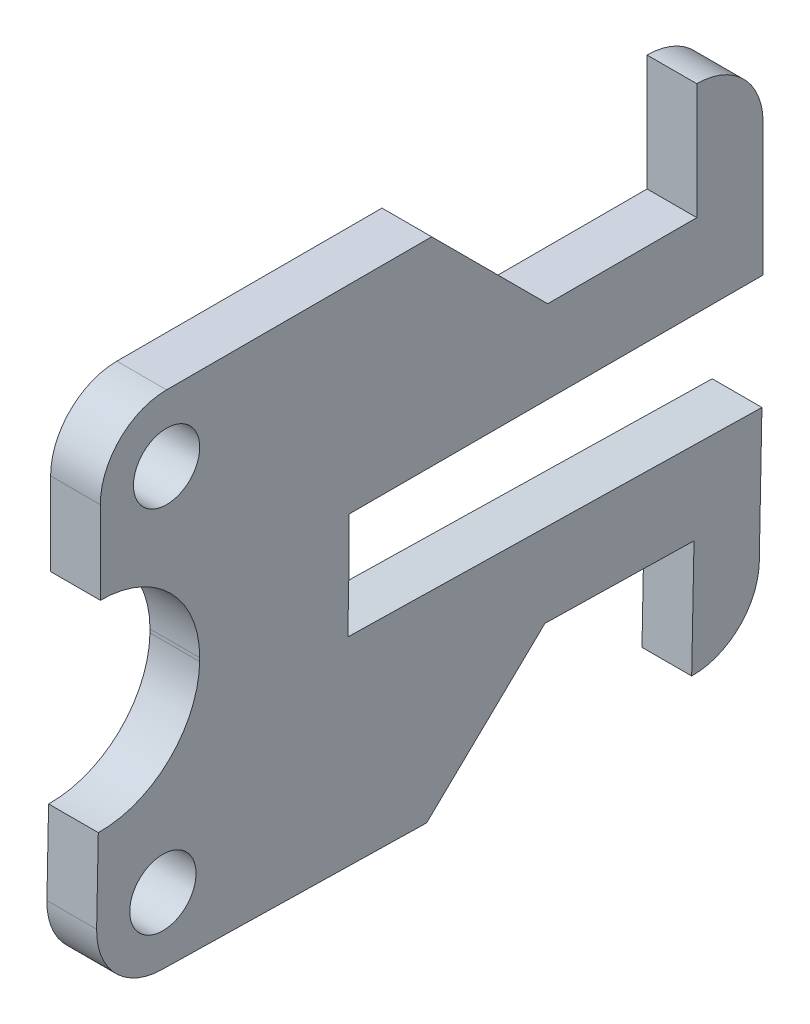
ISO-10303-21;
HEADER;
FILE_DESCRIPTION(('STEP AP214'),'2;1');
FILE_NAME('part.step','',(''),(''),'','','');
FILE_SCHEMA(('AUTOMOTIVE_DESIGN { 1 0 10303 214 1 1 1 1 }'));
ENDSEC;
DATA;
#1=APPLICATION_CONTEXT('core data for automotive mechanical design processes');
#2=APPLICATION_PROTOCOL_DEFINITION('international standard','automotive_design',2000,#1);
#3=PRODUCT_CONTEXT('',#1,'mechanical');
#4=PRODUCT('Part','Part','',(#3));
#5=PRODUCT_RELATED_PRODUCT_CATEGORY('part','',(#4));
#6=PRODUCT_DEFINITION_FORMATION('','',#4);
#7=PRODUCT_DEFINITION_CONTEXT('part definition',#1,'design');
#8=PRODUCT_DEFINITION('design','',#6,#7);
#9=PRODUCT_DEFINITION_SHAPE('','',#8);
#10=(LENGTH_UNIT() NAMED_UNIT(*) SI_UNIT(.MILLI.,.METRE.));
#11=(NAMED_UNIT(*) PLANE_ANGLE_UNIT() SI_UNIT($,.RADIAN.));
#12=(NAMED_UNIT(*) SI_UNIT($,.STERADIAN.) SOLID_ANGLE_UNIT());
#13=UNCERTAINTY_MEASURE_WITH_UNIT(LENGTH_MEASURE(1.E-05),#10,'distance_accuracy_value','');
#14=(GEOMETRIC_REPRESENTATION_CONTEXT(3) GLOBAL_UNCERTAINTY_ASSIGNED_CONTEXT((#13)) GLOBAL_UNIT_ASSIGNED_CONTEXT((#10,
#11,#12)) REPRESENTATION_CONTEXT('',''));
#15=CARTESIAN_POINT('',(0.,0.,0.));
#16=DIRECTION('',(0.,0.,1.));
#17=DIRECTION('',(1.,0.,0.));
#18=AXIS2_PLACEMENT_3D('',#15,#16,#17);
#19=CARTESIAN_POINT('',(1.5,-11.8042309209508,-20.7707604517279));
#20=DIRECTION('',(1.,0.,0.));
#21=DIRECTION('',(0.,0.,-1.));
#22=AXIS2_PLACEMENT_3D('',#19,#20,#21);
#23=PLANE('',#22);
#24=CARTESIAN_POINT('',(1.5,11.,11.));
#25=DIRECTION('',(1.,0.,0.));
#26=DIRECTION('',(0.,0.,-1.));
#27=AXIS2_PLACEMENT_3D('',#24,#25,#26);
#28=CIRCLE('',#27,2.);
#29=CARTESIAN_POINT('',(1.5,11.,9.));
#30=VERTEX_POINT('',#29);
#31=EDGE_CURVE('E236',#30,#30,#28,.T.);
#32=ORIENTED_EDGE('',*,*,#31,.F.);
#33=EDGE_LOOP('',(#32));
#34=FACE_BOUND('',#33,.T.);
#35=DIRECTION('',(0.,0.999949477443459,-0.010051992864757));
#36=VECTOR('',#35,1.);
#37=CARTESIAN_POINT('',(1.5,0.,0.));
#38=LINE('',#37,#36);
#39=CARTESIAN_POINT('',(1.5,-0.384291486762399,0.00386309045612848));
#40=VERTEX_POINT('',#39);
#41=CARTESIAN_POINT('',(1.5,0.,0.));
#42=VERTEX_POINT('',#41);
#43=EDGE_CURVE('E276',#40,#42,#38,.T.);
#44=ORIENTED_EDGE('',*,*,#43,.T.);
#45=DIRECTION('',(0.,1.,0.));
#46=VECTOR('',#45,1.);
#47=CARTESIAN_POINT('',(1.5,0.,0.));
#48=LINE('',#47,#46);
#49=CARTESIAN_POINT('',(1.5,3.,0.));
#50=VERTEX_POINT('',#49);
#51=EDGE_CURVE('E150',#42,#50,#48,.T.);
#52=ORIENTED_EDGE('',*,*,#51,.T.);
#53=DIRECTION('',(0.,0.,-1.));
#54=VECTOR('',#53,1.);
#55=CARTESIAN_POINT('',(1.5,3.,0.));
#56=LINE('',#55,#54);
#57=CARTESIAN_POINT('',(1.5,3.,-25.));
#58=VERTEX_POINT('',#57);
#59=EDGE_CURVE('E345',#50,#58,#56,.T.);
#60=ORIENTED_EDGE('',*,*,#59,.T.);
#61=DIRECTION('',(0.,1.,0.));
#62=VECTOR('',#61,1.);
#63=CARTESIAN_POINT('',(1.5,3.,-25.));
#64=LINE('',#63,#62);
#65=CARTESIAN_POINT('',(1.5,11.,-25.));
#66=VERTEX_POINT('',#65);
#67=EDGE_CURVE('E363',#58,#66,#64,.T.);
#68=ORIENTED_EDGE('',*,*,#67,.T.);
#69=CARTESIAN_POINT('',(1.5,11.,-21.));
#70=DIRECTION('',(1.,0.,0.));
#71=DIRECTION('',(0.,0.,1.));
#72=AXIS2_PLACEMENT_3D('',#69,#70,#71);
#73=CIRCLE('',#72,4.);
#74=CARTESIAN_POINT('',(1.5,15.,-21.));
#75=VERTEX_POINT('',#74);
#76=EDGE_CURVE('E356',#66,#75,#73,.T.);
#77=ORIENTED_EDGE('',*,*,#76,.T.);
#78=DIRECTION('',(0.,-1.,0.));
#79=VECTOR('',#78,1.);
#80=CARTESIAN_POINT('',(1.5,15.,-21.));
#81=LINE('',#80,#79);
#82=CARTESIAN_POINT('',(1.5,8.,-21.));
#83=VERTEX_POINT('',#82);
#84=EDGE_CURVE('E359',#75,#83,#81,.T.);
#85=ORIENTED_EDGE('',*,*,#84,.T.);
#86=DIRECTION('',(0.,0.,1.));
#87=VECTOR('',#86,1.);
#88=CARTESIAN_POINT('',(1.5,8.,-21.));
#89=LINE('',#88,#87);
#90=CARTESIAN_POINT('',(1.5,8.,-12.));
#91=VERTEX_POINT('',#90);
#92=EDGE_CURVE('E361',#83,#91,#89,.T.);
#93=ORIENTED_EDGE('',*,*,#92,.T.);
#94=DIRECTION('',(0.,0.707106781186549,0.707106781186546));
#95=VECTOR('',#94,1.);
#96=CARTESIAN_POINT('',(1.5,8.,-12.));
#97=LINE('',#96,#95);
#98=CARTESIAN_POINT('',(1.5,15.,-5.));
#99=VERTEX_POINT('',#98);
#100=EDGE_CURVE('E367',#91,#99,#97,.T.);
#101=ORIENTED_EDGE('',*,*,#100,.T.);
#102=DIRECTION('',(0.,0.,1.));
#103=VECTOR('',#102,1.);
#104=CARTESIAN_POINT('',(1.5,15.,-5.));
#105=LINE('',#104,#103);
#106=CARTESIAN_POINT('',(1.5,15.,11.));
#107=VERTEX_POINT('',#106);
#108=EDGE_CURVE('E371',#99,#107,#105,.T.);
#109=ORIENTED_EDGE('',*,*,#108,.T.);
#110=CARTESIAN_POINT('',(1.5,11.,11.));
#111=DIRECTION('',(1.,0.,0.));
#112=DIRECTION('',(0.,0.,-1.));
#113=AXIS2_PLACEMENT_3D('',#110,#111,#112);
#114=CIRCLE('',#113,4.);
#115=CARTESIAN_POINT('',(1.5,11.,15.));
#116=VERTEX_POINT('',#115);
#117=EDGE_CURVE('E373',#107,#116,#114,.T.);
#118=ORIENTED_EDGE('',*,*,#117,.T.);
#119=DIRECTION('',(0.,-1.,0.));
#120=VECTOR('',#119,1.);
#121=CARTESIAN_POINT('',(1.5,11.,15.));
#122=LINE('',#121,#120);
#123=CARTESIAN_POINT('',(1.5,6.,15.));
#124=VERTEX_POINT('',#123);
#125=EDGE_CURVE('E374',#116,#124,#122,.T.);
#126=ORIENTED_EDGE('',*,*,#125,.T.);
#127=CARTESIAN_POINT('',(1.5,0.,15.));
#128=DIRECTION('',(-1.,0.,0.));
#129=DIRECTION('',(0.,0.,1.));
#130=AXIS2_PLACEMENT_3D('',#127,#128,#129);
#131=CIRCLE('',#130,6.);
#132=CARTESIAN_POINT('',(1.5,0.,9.));
#133=VERTEX_POINT('',#132);
#134=EDGE_CURVE('E380',#124,#133,#131,.T.);
#135=ORIENTED_EDGE('',*,*,#134,.T.);
#136=DIRECTION('',(0.,-0.999949477443459,0.0100519928647722));
#137=VECTOR('',#136,1.);
#138=CARTESIAN_POINT('',(1.5,0.,9.));
#139=LINE('',#138,#137);
#140=CARTESIAN_POINT('',(1.5,-0.203364756539291,9.00204432436617));
#141=VERTEX_POINT('',#140);
#142=EDGE_CURVE('E378',#133,#141,#139,.T.);
#143=ORIENTED_EDGE('',*,*,#142,.T.);
#144=CARTESIAN_POINT('',(1.5,-0.0827469363905519,15.0008318136395));
#145=DIRECTION('',(-1.,0.,0.));
#146=DIRECTION('',(0.,0.,-1.));
#147=AXIS2_PLACEMENT_3D('',#144,#145,#146);
#148=CIRCLE('',#147,6.);
#149=CARTESIAN_POINT('',(1.5,-6.08153442566391,15.1214496337883));
#150=VERTEX_POINT('',#149);
#151=EDGE_CURVE('E382',#141,#150,#148,.T.);
#152=ORIENTED_EDGE('',*,*,#151,.T.);
#153=DIRECTION('',(0.,-0.999797914878893,0.0201029700247903));
#154=VECTOR('',#153,1.);
#155=CARTESIAN_POINT('',(1.5,-11.0805240000584,15.2219644839122));
#156=LINE('',#155,#154);
#157=CARTESIAN_POINT('',(1.5,-11.0805240000584,15.2219644839122));
#158=VERTEX_POINT('',#157);
#159=EDGE_CURVE('E384',#150,#158,#156,.T.);
#160=ORIENTED_EDGE('',*,*,#159,.T.);
#161=CARTESIAN_POINT('',(1.5,-11.1609358801575,11.2227728243966));
#162=DIRECTION('',(1.,0.,0.));
#163=DIRECTION('',(0.,0.,1.));
#164=AXIS2_PLACEMENT_3D('',#161,#162,#163);
#165=CIRCLE('',#164,4.);
#166=CARTESIAN_POINT('',(1.5,-15.1601275396731,11.3031847044958));
#167=VERTEX_POINT('',#166);
#168=EDGE_CURVE('E383',#158,#167,#165,.T.);
#169=ORIENTED_EDGE('',*,*,#168,.T.);
#170=DIRECTION('',(0.,-0.0201029700247899,-0.999797914878893));
#171=VECTOR('',#170,1.);
#172=CARTESIAN_POINT('',(1.5,-15.4817750600697,-4.69358193356649));
#173=LINE('',#172,#171);
#174=CARTESIAN_POINT('',(1.5,-15.4817750600697,-4.69358193356649));
#175=VERTEX_POINT('',#174);
#176=EDGE_CURVE('E390',#167,#175,#173,.T.);
#177=ORIENTED_EDGE('',*,*,#176,.T.);
#178=DIRECTION('',(0.,0.692748939000518,-0.721178831853554));
#179=VECTOR('',#178,1.);
#180=CARTESIAN_POINT('',(1.5,-8.62391044609102,-11.8328881278922));
#181=LINE('',#180,#179);
#182=CARTESIAN_POINT('',(1.5,-8.62391044609102,-11.8328881278922));
#183=VERTEX_POINT('',#182);
#184=EDGE_CURVE('E386',#175,#183,#181,.T.);
#185=ORIENTED_EDGE('',*,*,#184,.T.);
#186=DIRECTION('',(0.,-0.0201029700247897,-0.999797914878893));
#187=VECTOR('',#186,1.);
#188=CARTESIAN_POINT('',(1.5,-8.80483717631413,-20.8310693618023));
#189=LINE('',#188,#187);
#190=CARTESIAN_POINT('',(1.5,-8.80483717631413,-20.8310693618023));
#191=VERTEX_POINT('',#190);
#192=EDGE_CURVE('E391',#183,#191,#189,.T.);
#193=ORIENTED_EDGE('',*,*,#192,.T.);
#194=DIRECTION('',(0.,-0.999797914878893,0.0201029700247907));
#195=VECTOR('',#194,1.);
#196=CARTESIAN_POINT('',(1.5,-15.8034225804664,-20.6903485716288));
#197=LINE('',#196,#195);
#198=CARTESIAN_POINT('',(1.5,-15.8034225804664,-20.6903485716288));
#199=VERTEX_POINT('',#198);
#200=EDGE_CURVE('E392',#191,#199,#197,.T.);
#201=ORIENTED_EDGE('',*,*,#200,.T.);
#202=CARTESIAN_POINT('',(1.5,-11.8042309209508,-20.7707604517279));
#203=DIRECTION('',(1.,0.,0.));
#204=DIRECTION('',(0.,0.,-1.));
#205=AXIS2_PLACEMENT_3D('',#202,#203,#204);
#206=CIRCLE('',#205,4.);
#207=CARTESIAN_POINT('',(1.5,-11.88464280105,-24.7699521112435));
#208=VERTEX_POINT('',#207);
#209=EDGE_CURVE('E211',#199,#208,#206,.T.);
#210=ORIENTED_EDGE('',*,*,#209,.T.);
#211=DIRECTION('',(0.,0.999797914878893,-0.0201029700247898));
#212=VECTOR('',#211,1.);
#213=CARTESIAN_POINT('',(1.5,-3.88625948201883,-24.9307758714418));
#214=LINE('',#213,#212);
#215=CARTESIAN_POINT('',(1.5,-3.88625948201883,-24.9307758714418));
#216=VERTEX_POINT('',#215);
#217=EDGE_CURVE('E206',#208,#216,#214,.T.);
#218=ORIENTED_EDGE('',*,*,#217,.T.);
#219=DIRECTION('',(0.,0.0201029700247899,0.999797914878893));
#220=VECTOR('',#219,1.);
#221=CARTESIAN_POINT('',(1.5,-3.38368523139907,0.0641720005307364));
#222=LINE('',#221,#220);
#223=CARTESIAN_POINT('',(1.5,-3.38368523139907,0.0641720005307364));
#224=VERTEX_POINT('',#223);
#225=EDGE_CURVE('E215',#216,#224,#222,.T.);
#226=ORIENTED_EDGE('',*,*,#225,.T.);
#227=DIRECTION('',(0.,0.999797914878891,-0.0201029700248693));
#228=VECTOR('',#227,1.);
#229=CARTESIAN_POINT('',(1.5,-0.384291486762399,0.00386309045612848));
#230=LINE('',#229,#228);
#231=EDGE_CURVE('E57',#224,#40,#230,.T.);
#232=ORIENTED_EDGE('',*,*,#231,.T.);
#233=EDGE_LOOP('',(#44,#52,#60,#68,#77,#85,#93,#101,#109,#118,#126,#135,#143,#152,#160,#169,
#177,#185,#193,#201,#210,#218,#226,#232));
#234=FACE_BOUND('',#233,.T.);
#235=CARTESIAN_POINT('',(1.5,-11.1609358801575,11.2227728243966));
#236=DIRECTION('',(1.,0.,0.));
#237=DIRECTION('',(0.,0.,1.));
#238=AXIS2_PLACEMENT_3D('',#235,#236,#237);
#239=CIRCLE('',#238,1.99999999999891);
#240=CARTESIAN_POINT('',(1.5,-11.1609358801575,13.2227728243956));
#241=VERTEX_POINT('',#240);
#242=EDGE_CURVE('E434',#241,#241,#239,.T.);
#243=ORIENTED_EDGE('',*,*,#242,.F.);
#244=EDGE_LOOP('',(#243));
#245=FACE_BOUND('',#244,.T.);
#246=ADVANCED_FACE('F39',(#34,#234,#245),#23,.T.);
#247=CARTESIAN_POINT('',(-1.5,-11.8042309209508,-20.7707604517279));
#248=DIRECTION('',(1.,0.,0.));
#249=DIRECTION('',(0.,0.,-1.));
#250=AXIS2_PLACEMENT_3D('',#247,#248,#249);
#251=PLANE('',#250);
#252=DIRECTION('',(0.,0.999949477443459,-0.010051992864757));
#253=VECTOR('',#252,1.);
#254=CARTESIAN_POINT('',(-1.5,0.,0.));
#255=LINE('',#254,#253);
#256=CARTESIAN_POINT('',(-1.5,-0.384291486762399,0.00386309045612848));
#257=VERTEX_POINT('',#256);
#258=CARTESIAN_POINT('',(-1.5,0.,0.));
#259=VERTEX_POINT('',#258);
#260=EDGE_CURVE('E235',#257,#259,#255,.T.);
#261=ORIENTED_EDGE('',*,*,#260,.F.);
#262=DIRECTION('',(0.,0.999797914878891,-0.0201029700248693));
#263=VECTOR('',#262,1.);
#264=CARTESIAN_POINT('',(-1.5,-0.384291486762399,0.00386309045612848));
#265=LINE('',#264,#263);
#266=CARTESIAN_POINT('',(-1.5,-3.38368523139907,0.0641720005307364));
#267=VERTEX_POINT('',#266);
#268=EDGE_CURVE('E138',#267,#257,#265,.T.);
#269=ORIENTED_EDGE('',*,*,#268,.F.);
#270=DIRECTION('',(0.,0.0201029700247899,0.999797914878893));
#271=VECTOR('',#270,1.);
#272=CARTESIAN_POINT('',(-1.5,-3.38368523139907,0.0641720005307364));
#273=LINE('',#272,#271);
#274=CARTESIAN_POINT('',(-1.5,-3.88625948201883,-24.9307758714418));
#275=VERTEX_POINT('',#274);
#276=EDGE_CURVE('E132',#275,#267,#273,.T.);
#277=ORIENTED_EDGE('',*,*,#276,.F.);
#278=DIRECTION('',(0.,0.999797914878893,-0.0201029700247898));
#279=VECTOR('',#278,1.);
#280=CARTESIAN_POINT('',(-1.5,-3.88625948201883,-24.9307758714418));
#281=LINE('',#280,#279);
#282=CARTESIAN_POINT('',(-1.5,-11.88464280105,-24.7699521112435));
#283=VERTEX_POINT('',#282);
#284=EDGE_CURVE('E221',#283,#275,#281,.T.);
#285=ORIENTED_EDGE('',*,*,#284,.F.);
#286=CARTESIAN_POINT('',(-1.5,-11.8042309209508,-20.7707604517279));
#287=DIRECTION('',(1.,0.,0.));
#288=DIRECTION('',(0.,0.,-1.));
#289=AXIS2_PLACEMENT_3D('',#286,#287,#288);
#290=CIRCLE('',#289,4.);
#291=CARTESIAN_POINT('',(-1.5,-15.8034225804664,-20.6903485716288));
#292=VERTEX_POINT('',#291);
#293=EDGE_CURVE('E274',#292,#283,#290,.T.);
#294=ORIENTED_EDGE('',*,*,#293,.F.);
#295=DIRECTION('',(0.,-0.999797914878893,0.0201029700247907));
#296=VECTOR('',#295,1.);
#297=CARTESIAN_POINT('',(-1.5,-15.8034225804664,-20.6903485716288));
#298=LINE('',#297,#296);
#299=CARTESIAN_POINT('',(-1.5,-8.80483717631413,-20.8310693618023));
#300=VERTEX_POINT('',#299);
#301=EDGE_CURVE('E275',#300,#292,#298,.T.);
#302=ORIENTED_EDGE('',*,*,#301,.F.);
#303=DIRECTION('',(0.,-0.0201029700247897,-0.999797914878893));
#304=VECTOR('',#303,1.);
#305=CARTESIAN_POINT('',(-1.5,-8.80483717631413,-20.8310693618023));
#306=LINE('',#305,#304);
#307=CARTESIAN_POINT('',(-1.5,-8.62391044609102,-11.8328881278922));
#308=VERTEX_POINT('',#307);
#309=EDGE_CURVE('E267',#308,#300,#306,.T.);
#310=ORIENTED_EDGE('',*,*,#309,.F.);
#311=DIRECTION('',(0.,0.692748939000518,-0.721178831853554));
#312=VECTOR('',#311,1.);
#313=CARTESIAN_POINT('',(-1.5,-8.62391044609102,-11.8328881278922));
#314=LINE('',#313,#312);
#315=CARTESIAN_POINT('',(-1.5,-15.4817750600697,-4.69358193356649));
#316=VERTEX_POINT('',#315);
#317=EDGE_CURVE('E270',#316,#308,#314,.T.);
#318=ORIENTED_EDGE('',*,*,#317,.F.);
#319=DIRECTION('',(0.,-0.0201029700247899,-0.999797914878893));
#320=VECTOR('',#319,1.);
#321=CARTESIAN_POINT('',(-1.5,-15.4817750600697,-4.69358193356649));
#322=LINE('',#321,#320);
#323=CARTESIAN_POINT('',(-1.5,-15.1601275396731,11.3031847044958));
#324=VERTEX_POINT('',#323);
#325=EDGE_CURVE('E269',#324,#316,#322,.T.);
#326=ORIENTED_EDGE('',*,*,#325,.F.);
#327=CARTESIAN_POINT('',(-1.5,-11.1609358801575,11.2227728243966));
#328=DIRECTION('',(1.,0.,0.));
#329=DIRECTION('',(0.,0.,1.));
#330=AXIS2_PLACEMENT_3D('',#327,#328,#329);
#331=CIRCLE('',#330,4.);
#332=CARTESIAN_POINT('',(-1.5,-11.0805240000584,15.2219644839122));
#333=VERTEX_POINT('',#332);
#334=EDGE_CURVE('E263',#333,#324,#331,.T.);
#335=ORIENTED_EDGE('',*,*,#334,.F.);
#336=DIRECTION('',(0.,-0.999797914878893,0.0201029700247903));
#337=VECTOR('',#336,1.);
#338=CARTESIAN_POINT('',(-1.5,-11.0805240000584,15.2219644839122));
#339=LINE('',#338,#337);
#340=CARTESIAN_POINT('',(-1.5,-6.08153442566391,15.1214496337883));
#341=VERTEX_POINT('',#340);
#342=EDGE_CURVE('E265',#341,#333,#339,.T.);
#343=ORIENTED_EDGE('',*,*,#342,.F.);
#344=CARTESIAN_POINT('',(-1.5,-0.0827469363905519,15.0008318136395));
#345=DIRECTION('',(-1.,0.,0.));
#346=DIRECTION('',(0.,0.,-1.));
#347=AXIS2_PLACEMENT_3D('',#344,#345,#346);
#348=CIRCLE('',#347,6.);
#349=CARTESIAN_POINT('',(-1.5,-0.203364756539291,9.00204432436617));
#350=VERTEX_POINT('',#349);
#351=EDGE_CURVE('E258',#350,#341,#348,.T.);
#352=ORIENTED_EDGE('',*,*,#351,.F.);
#353=DIRECTION('',(0.,-0.999949477443459,0.0100519928647722));
#354=VECTOR('',#353,1.);
#355=CARTESIAN_POINT('',(-1.5,0.,9.));
#356=LINE('',#355,#354);
#357=CARTESIAN_POINT('',(-1.5,0.,9.));
#358=VERTEX_POINT('',#357);
#359=EDGE_CURVE('E259',#358,#350,#356,.T.);
#360=ORIENTED_EDGE('',*,*,#359,.F.);
#361=CARTESIAN_POINT('',(-1.5,0.,15.));
#362=DIRECTION('',(-1.,0.,0.));
#363=DIRECTION('',(0.,0.,1.));
#364=AXIS2_PLACEMENT_3D('',#361,#362,#363);
#365=CIRCLE('',#364,6.);
#366=CARTESIAN_POINT('',(-1.5,6.,15.));
#367=VERTEX_POINT('',#366);
#368=EDGE_CURVE('E257',#367,#358,#365,.T.);
#369=ORIENTED_EDGE('',*,*,#368,.F.);
#370=DIRECTION('',(0.,-1.,0.));
#371=VECTOR('',#370,1.);
#372=CARTESIAN_POINT('',(-1.5,11.,15.));
#373=LINE('',#372,#371);
#374=CARTESIAN_POINT('',(-1.5,11.,15.));
#375=VERTEX_POINT('',#374);
#376=EDGE_CURVE('E251',#375,#367,#373,.T.);
#377=ORIENTED_EDGE('',*,*,#376,.F.);
#378=CARTESIAN_POINT('',(-1.5,11.,11.));
#379=DIRECTION('',(1.,0.,0.));
#380=DIRECTION('',(0.,0.,-1.));
#381=AXIS2_PLACEMENT_3D('',#378,#379,#380);
#382=CIRCLE('',#381,4.);
#383=CARTESIAN_POINT('',(-1.5,15.,11.));
#384=VERTEX_POINT('',#383);
#385=EDGE_CURVE('E255',#384,#375,#382,.T.);
#386=ORIENTED_EDGE('',*,*,#385,.F.);
#387=DIRECTION('',(0.,0.,1.));
#388=VECTOR('',#387,1.);
#389=CARTESIAN_POINT('',(-1.5,15.,-5.));
#390=LINE('',#389,#388);
#391=CARTESIAN_POINT('',(-1.5,15.,-5.));
#392=VERTEX_POINT('',#391);
#393=EDGE_CURVE('E249',#392,#384,#390,.T.);
#394=ORIENTED_EDGE('',*,*,#393,.F.);
#395=DIRECTION('',(0.,0.707106781186549,0.707106781186546));
#396=VECTOR('',#395,1.);
#397=CARTESIAN_POINT('',(-1.5,8.,-12.));
#398=LINE('',#397,#396);
#399=CARTESIAN_POINT('',(-1.5,8.,-12.));
#400=VERTEX_POINT('',#399);
#401=EDGE_CURVE('E247',#400,#392,#398,.T.);
#402=ORIENTED_EDGE('',*,*,#401,.F.);
#403=DIRECTION('',(0.,0.,1.));
#404=VECTOR('',#403,1.);
#405=CARTESIAN_POINT('',(-1.5,8.,-21.));
#406=LINE('',#405,#404);
#407=CARTESIAN_POINT('',(-1.5,8.,-21.));
#408=VERTEX_POINT('',#407);
#409=EDGE_CURVE('E246',#408,#400,#406,.T.);
#410=ORIENTED_EDGE('',*,*,#409,.F.);
#411=DIRECTION('',(0.,-1.,0.));
#412=VECTOR('',#411,1.);
#413=CARTESIAN_POINT('',(-1.5,15.,-21.));
#414=LINE('',#413,#412);
#415=CARTESIAN_POINT('',(-1.5,15.,-21.));
#416=VERTEX_POINT('',#415);
#417=EDGE_CURVE('E242',#416,#408,#414,.T.);
#418=ORIENTED_EDGE('',*,*,#417,.F.);
#419=CARTESIAN_POINT('',(-1.5,11.,-21.));
#420=DIRECTION('',(1.,0.,0.));
#421=DIRECTION('',(0.,0.,1.));
#422=AXIS2_PLACEMENT_3D('',#419,#420,#421);
#423=CIRCLE('',#422,4.);
#424=CARTESIAN_POINT('',(-1.5,11.,-25.));
#425=VERTEX_POINT('',#424);
#426=EDGE_CURVE('E245',#425,#416,#423,.T.);
#427=ORIENTED_EDGE('',*,*,#426,.F.);
#428=DIRECTION('',(0.,1.,0.));
#429=VECTOR('',#428,1.);
#430=CARTESIAN_POINT('',(-1.5,3.,-25.));
#431=LINE('',#430,#429);
#432=CARTESIAN_POINT('',(-1.5,3.,-25.));
#433=VERTEX_POINT('',#432);
#434=EDGE_CURVE('E239',#433,#425,#431,.T.);
#435=ORIENTED_EDGE('',*,*,#434,.F.);
#436=DIRECTION('',(0.,0.,-1.));
#437=VECTOR('',#436,1.);
#438=CARTESIAN_POINT('',(-1.5,3.,0.));
#439=LINE('',#438,#437);
#440=CARTESIAN_POINT('',(-1.5,3.,0.));
#441=VERTEX_POINT('',#440);
#442=EDGE_CURVE('E238',#441,#433,#439,.T.);
#443=ORIENTED_EDGE('',*,*,#442,.F.);
#444=DIRECTION('',(0.,1.,0.));
#445=VECTOR('',#444,1.);
#446=CARTESIAN_POINT('',(-1.5,0.,0.));
#447=LINE('',#446,#445);
#448=EDGE_CURVE('E232',#259,#441,#447,.T.);
#449=ORIENTED_EDGE('',*,*,#448,.F.);
#450=EDGE_LOOP('',(#261,#269,#277,#285,#294,#302,#310,#318,#326,#335,#343,#352,#360,#369,#377,
#386,#394,#402,#410,#418,#427,#435,#443,#449));
#451=FACE_BOUND('',#450,.T.);
#452=CARTESIAN_POINT('',(-1.5,11.,11.));
#453=DIRECTION('',(1.,0.,0.));
#454=DIRECTION('',(0.,0.,-1.));
#455=AXIS2_PLACEMENT_3D('',#452,#453,#454);
#456=CIRCLE('',#455,2.);
#457=CARTESIAN_POINT('',(-1.5,11.,9.));
#458=VERTEX_POINT('',#457);
#459=EDGE_CURVE('E441',#458,#458,#456,.T.);
#460=ORIENTED_EDGE('',*,*,#459,.T.);
#461=EDGE_LOOP('',(#460));
#462=FACE_BOUND('',#461,.T.);
#463=CARTESIAN_POINT('',(-1.5,-11.1609358801575,11.2227728243966));
#464=DIRECTION('',(1.,0.,0.));
#465=DIRECTION('',(0.,0.,1.));
#466=AXIS2_PLACEMENT_3D('',#463,#464,#465);
#467=CIRCLE('',#466,1.99999999999891);
#468=CARTESIAN_POINT('',(-1.5,-11.1609358801575,13.2227728243956));
#469=VERTEX_POINT('',#468);
#470=EDGE_CURVE('E438',#469,#469,#467,.T.);
#471=ORIENTED_EDGE('',*,*,#470,.T.);
#472=EDGE_LOOP('',(#471));
#473=FACE_BOUND('',#472,.T.);
#474=ADVANCED_FACE('F346',(#451,#462,#473),#251,.F.);
#475=CARTESIAN_POINT('',(1.5,0.,0.));
#476=DIRECTION('',(0.,0.010051992864757,0.999949477443459));
#477=DIRECTION('',(0.,-0.999949477443459,0.010051992864757));
#478=AXIS2_PLACEMENT_3D('',#475,#476,#477);
#479=PLANE('',#478);
#480=ORIENTED_EDGE('',*,*,#260,.T.);
#481=DIRECTION('',(-1.,0.,0.));
#482=VECTOR('',#481,1.);
#483=CARTESIAN_POINT('',(1.5,0.,0.));
#484=LINE('',#483,#482);
#485=EDGE_CURVE('E11',#42,#259,#484,.T.);
#486=ORIENTED_EDGE('',*,*,#485,.F.);
#487=ORIENTED_EDGE('',*,*,#43,.F.);
#488=DIRECTION('',(-1.,0.,0.));
#489=VECTOR('',#488,1.);
#490=CARTESIAN_POINT('',(1.5,-0.384291486762399,0.00386309045612848));
#491=LINE('',#490,#489);
#492=EDGE_CURVE('E226',#40,#257,#491,.T.);
#493=ORIENTED_EDGE('',*,*,#492,.T.);
#494=EDGE_LOOP('',(#480,#486,#487,#493));
#495=FACE_BOUND('',#494,.T.);
#496=ADVANCED_FACE('F41',(#495),#479,.F.);
#497=CARTESIAN_POINT('',(1.5,0.,0.));
#498=DIRECTION('',(0.,0.,1.));
#499=DIRECTION('',(1.,0.,0.));
#500=AXIS2_PLACEMENT_3D('',#497,#498,#499);
#501=PLANE('',#500);
#502=ORIENTED_EDGE('',*,*,#448,.T.);
#503=DIRECTION('',(-1.,0.,0.));
#504=VECTOR('',#503,1.);
#505=CARTESIAN_POINT('',(1.5,3.,0.));
#506=LINE('',#505,#504);
#507=EDGE_CURVE('E48',#50,#441,#506,.T.);
#508=ORIENTED_EDGE('',*,*,#507,.F.);
#509=ORIENTED_EDGE('',*,*,#51,.F.);
#510=ORIENTED_EDGE('',*,*,#485,.T.);
#511=EDGE_LOOP('',(#502,#508,#509,#510));
#512=FACE_BOUND('',#511,.T.);
#513=ADVANCED_FACE('F659',(#512),#501,.F.);
#514=CARTESIAN_POINT('',(1.5,3.,0.));
#515=DIRECTION('',(0.,1.,0.));
#516=DIRECTION('',(0.,0.,1.));
#517=AXIS2_PLACEMENT_3D('',#514,#515,#516);
#518=PLANE('',#517);
#519=ORIENTED_EDGE('',*,*,#442,.T.);
#520=DIRECTION('',(-1.,0.,0.));
#521=VECTOR('',#520,1.);
#522=CARTESIAN_POINT('',(1.5,3.,-25.));
#523=LINE('',#522,#521);
#524=EDGE_CURVE('E333',#58,#433,#523,.T.);
#525=ORIENTED_EDGE('',*,*,#524,.F.);
#526=ORIENTED_EDGE('',*,*,#59,.F.);
#527=ORIENTED_EDGE('',*,*,#507,.T.);
#528=EDGE_LOOP('',(#519,#525,#526,#527));
#529=FACE_BOUND('',#528,.T.);
#530=ADVANCED_FACE('F338',(#529),#518,.F.);
#531=CARTESIAN_POINT('',(1.5,3.,-25.));
#532=DIRECTION('',(0.,0.,1.));
#533=DIRECTION('',(1.,0.,0.));
#534=AXIS2_PLACEMENT_3D('',#531,#532,#533);
#535=PLANE('',#534);
#536=ORIENTED_EDGE('',*,*,#434,.T.);
#537=DIRECTION('',(-1.,0.,0.));
#538=VECTOR('',#537,1.);
#539=CARTESIAN_POINT('',(1.5,11.,-25.));
#540=LINE('',#539,#538);
#541=EDGE_CURVE('E334',#66,#425,#540,.T.);
#542=ORIENTED_EDGE('',*,*,#541,.F.);
#543=ORIENTED_EDGE('',*,*,#67,.F.);
#544=ORIENTED_EDGE('',*,*,#524,.T.);
#545=EDGE_LOOP('',(#536,#542,#543,#544));
#546=FACE_BOUND('',#545,.T.);
#547=ADVANCED_FACE('F351',(#546),#535,.F.);
#548=CARTESIAN_POINT('',(1.5,11.,-21.));
#549=DIRECTION('',(-1.,0.,0.));
#550=DIRECTION('',(0.,0.,1.));
#551=AXIS2_PLACEMENT_3D('',#548,#549,#550);
#552=CYLINDRICAL_SURFACE('',#551,4.);
#553=ORIENTED_EDGE('',*,*,#426,.T.);
#554=DIRECTION('',(-1.,0.,0.));
#555=VECTOR('',#554,1.);
#556=CARTESIAN_POINT('',(1.5,15.,-21.));
#557=LINE('',#556,#555);
#558=EDGE_CURVE('E327',#75,#416,#557,.T.);
#559=ORIENTED_EDGE('',*,*,#558,.F.);
#560=ORIENTED_EDGE('',*,*,#76,.F.);
#561=ORIENTED_EDGE('',*,*,#541,.T.);
#562=EDGE_LOOP('',(#553,#559,#560,#561));
#563=FACE_BOUND('',#562,.T.);
#564=ADVANCED_FACE('F358',(#563),#552,.T.);
#565=CARTESIAN_POINT('',(1.5,15.,-21.));
#566=DIRECTION('',(0.,0.,-1.));
#567=DIRECTION('',(-1.,0.,0.));
#568=AXIS2_PLACEMENT_3D('',#565,#566,#567);
#569=PLANE('',#568);
#570=ORIENTED_EDGE('',*,*,#417,.T.);
#571=DIRECTION('',(-1.,0.,0.));
#572=VECTOR('',#571,1.);
#573=CARTESIAN_POINT('',(1.5,8.,-21.));
#574=LINE('',#573,#572);
#575=EDGE_CURVE('E323',#83,#408,#574,.T.);
#576=ORIENTED_EDGE('',*,*,#575,.F.);
#577=ORIENTED_EDGE('',*,*,#84,.F.);
#578=ORIENTED_EDGE('',*,*,#558,.T.);
#579=EDGE_LOOP('',(#570,#576,#577,#578));
#580=FACE_BOUND('',#579,.T.);
#581=ADVANCED_FACE('F623',(#580),#569,.F.);
#582=CARTESIAN_POINT('',(1.5,8.,-21.));
#583=DIRECTION('',(0.,-1.,0.));
#584=DIRECTION('',(0.,0.,-1.));
#585=AXIS2_PLACEMENT_3D('',#582,#583,#584);
#586=PLANE('',#585);
#587=ORIENTED_EDGE('',*,*,#409,.T.);
#588=DIRECTION('',(-1.,0.,0.));
#589=VECTOR('',#588,1.);
#590=CARTESIAN_POINT('',(1.5,8.,-12.));
#591=LINE('',#590,#589);
#592=EDGE_CURVE('E325',#91,#400,#591,.T.);
#593=ORIENTED_EDGE('',*,*,#592,.F.);
#594=ORIENTED_EDGE('',*,*,#92,.F.);
#595=ORIENTED_EDGE('',*,*,#575,.T.);
#596=EDGE_LOOP('',(#587,#593,#594,#595));
#597=FACE_BOUND('',#596,.T.);
#598=ADVANCED_FACE('F614',(#597),#586,.F.);
#599=CARTESIAN_POINT('',(1.5,8.,-12.));
#600=DIRECTION('',(0.,-0.707106781186546,0.707106781186549));
#601=DIRECTION('',(0.,-0.707106781186549,-0.707106781186546));
#602=AXIS2_PLACEMENT_3D('',#599,#600,#601);
#603=PLANE('',#602);
#604=ORIENTED_EDGE('',*,*,#401,.T.);
#605=DIRECTION('',(-1.,0.,0.));
#606=VECTOR('',#605,1.);
#607=CARTESIAN_POINT('',(1.5,15.,-5.));
#608=LINE('',#607,#606);
#609=EDGE_CURVE('E316',#99,#392,#608,.T.);
#610=ORIENTED_EDGE('',*,*,#609,.F.);
#611=ORIENTED_EDGE('',*,*,#100,.F.);
#612=ORIENTED_EDGE('',*,*,#592,.T.);
#613=EDGE_LOOP('',(#604,#610,#611,#612));
#614=FACE_BOUND('',#613,.T.);
#615=ADVANCED_FACE('F602',(#614),#603,.F.);
#616=CARTESIAN_POINT('',(1.5,15.,-5.));
#617=DIRECTION('',(0.,-1.,0.));
#618=DIRECTION('',(0.,0.,-1.));
#619=AXIS2_PLACEMENT_3D('',#616,#617,#618);
#620=PLANE('',#619);
#621=ORIENTED_EDGE('',*,*,#393,.T.);
#622=DIRECTION('',(-1.,0.,0.));
#623=VECTOR('',#622,1.);
#624=CARTESIAN_POINT('',(1.5,15.,11.));
#625=LINE('',#624,#623);
#626=EDGE_CURVE('E317',#107,#384,#625,.T.);
#627=ORIENTED_EDGE('',*,*,#626,.F.);
#628=ORIENTED_EDGE('',*,*,#108,.F.);
#629=ORIENTED_EDGE('',*,*,#609,.T.);
#630=EDGE_LOOP('',(#621,#627,#628,#629));
#631=FACE_BOUND('',#630,.T.);
#632=ADVANCED_FACE('F594',(#631),#620,.F.);
#633=CARTESIAN_POINT('',(1.5,11.,11.));
#634=DIRECTION('',(-1.,0.,0.));
#635=DIRECTION('',(0.,0.,1.));
#636=AXIS2_PLACEMENT_3D('',#633,#634,#635);
#637=CYLINDRICAL_SURFACE('',#636,4.);
#638=ORIENTED_EDGE('',*,*,#385,.T.);
#639=DIRECTION('',(-1.,0.,0.));
#640=VECTOR('',#639,1.);
#641=CARTESIAN_POINT('',(1.5,11.,15.));
#642=LINE('',#641,#640);
#643=EDGE_CURVE('E312',#116,#375,#642,.T.);
#644=ORIENTED_EDGE('',*,*,#643,.F.);
#645=ORIENTED_EDGE('',*,*,#117,.F.);
#646=ORIENTED_EDGE('',*,*,#626,.T.);
#647=EDGE_LOOP('',(#638,#644,#645,#646));
#648=FACE_BOUND('',#647,.T.);
#649=ADVANCED_FACE('F582',(#648),#637,.T.);
#650=CARTESIAN_POINT('',(1.5,11.,15.));
#651=DIRECTION('',(0.,0.,-1.));
#652=DIRECTION('',(0.,1.,0.));
#653=AXIS2_PLACEMENT_3D('',#650,#651,#652);
#654=PLANE('',#653);
#655=ORIENTED_EDGE('',*,*,#376,.T.);
#656=DIRECTION('',(-1.,0.,0.));
#657=VECTOR('',#656,1.);
#658=CARTESIAN_POINT('',(1.5,6.,15.));
#659=LINE('',#658,#657);
#660=EDGE_CURVE('E309',#124,#367,#659,.T.);
#661=ORIENTED_EDGE('',*,*,#660,.F.);
#662=ORIENTED_EDGE('',*,*,#125,.F.);
#663=ORIENTED_EDGE('',*,*,#643,.T.);
#664=EDGE_LOOP('',(#655,#661,#662,#663));
#665=FACE_BOUND('',#664,.T.);
#666=ADVANCED_FACE('F571',(#665),#654,.F.);
#667=CARTESIAN_POINT('',(1.5,0.,15.));
#668=DIRECTION('',(-1.,0.,0.));
#669=DIRECTION('',(0.,0.,1.));
#670=AXIS2_PLACEMENT_3D('',#667,#668,#669);
#671=CYLINDRICAL_SURFACE('',#670,6.);
#672=ORIENTED_EDGE('',*,*,#368,.T.);
#673=DIRECTION('',(-1.,0.,0.));
#674=VECTOR('',#673,1.);
#675=CARTESIAN_POINT('',(1.5,0.,9.));
#676=LINE('',#675,#674);
#677=EDGE_CURVE('E310',#133,#358,#676,.T.);
#678=ORIENTED_EDGE('',*,*,#677,.F.);
#679=ORIENTED_EDGE('',*,*,#134,.F.);
#680=ORIENTED_EDGE('',*,*,#660,.T.);
#681=EDGE_LOOP('',(#672,#678,#679,#680));
#682=FACE_BOUND('',#681,.T.);
#683=ADVANCED_FACE('F561',(#682),#671,.F.);
#684=CARTESIAN_POINT('',(1.5,0.,9.));
#685=DIRECTION('',(0.,-0.0100519928647722,-0.999949477443459));
#686=DIRECTION('',(0.,0.999949477443459,-0.0100519928647722));
#687=AXIS2_PLACEMENT_3D('',#684,#685,#686);
#688=PLANE('',#687);
#689=ORIENTED_EDGE('',*,*,#359,.T.);
#690=DIRECTION('',(-1.,0.,0.));
#691=VECTOR('',#690,1.);
#692=CARTESIAN_POINT('',(1.5,-0.203364756539291,9.00204432436617));
#693=LINE('',#692,#691);
#694=EDGE_CURVE('E302',#141,#350,#693,.T.);
#695=ORIENTED_EDGE('',*,*,#694,.F.);
#696=ORIENTED_EDGE('',*,*,#142,.F.);
#697=ORIENTED_EDGE('',*,*,#677,.T.);
#698=EDGE_LOOP('',(#689,#695,#696,#697));
#699=FACE_BOUND('',#698,.T.);
#700=ADVANCED_FACE('F553',(#699),#688,.F.);
#701=CARTESIAN_POINT('',(1.5,-0.0827469363905519,15.0008318136395));
#702=DIRECTION('',(-1.,0.,0.));
#703=DIRECTION('',(0.,0.,1.));
#704=AXIS2_PLACEMENT_3D('',#701,#702,#703);
#705=CYLINDRICAL_SURFACE('',#704,6.);
#706=ORIENTED_EDGE('',*,*,#351,.T.);
#707=DIRECTION('',(-1.,0.,0.));
#708=VECTOR('',#707,1.);
#709=CARTESIAN_POINT('',(1.5,-6.08153442566391,15.1214496337883));
#710=LINE('',#709,#708);
#711=EDGE_CURVE('E301',#150,#341,#710,.T.);
#712=ORIENTED_EDGE('',*,*,#711,.F.);
#713=ORIENTED_EDGE('',*,*,#151,.F.);
#714=ORIENTED_EDGE('',*,*,#694,.T.);
#715=EDGE_LOOP('',(#706,#712,#713,#714));
#716=FACE_BOUND('',#715,.T.);
#717=ADVANCED_FACE('F541',(#716),#705,.F.);
#718=CARTESIAN_POINT('',(1.5,-11.0805240000584,15.2219644839122));
#719=DIRECTION('',(0.,-0.0201029700247903,-0.999797914878893));
#720=DIRECTION('',(0.,0.999797914878893,-0.0201029700247903));
#721=AXIS2_PLACEMENT_3D('',#718,#719,#720);
#722=PLANE('',#721);
#723=ORIENTED_EDGE('',*,*,#342,.T.);
#724=DIRECTION('',(-1.,0.,0.));
#725=VECTOR('',#724,1.);
#726=CARTESIAN_POINT('',(1.5,-11.0805240000584,15.2219644839122));
#727=LINE('',#726,#725);
#728=EDGE_CURVE('E296',#158,#333,#727,.T.);
#729=ORIENTED_EDGE('',*,*,#728,.F.);
#730=ORIENTED_EDGE('',*,*,#159,.F.);
#731=ORIENTED_EDGE('',*,*,#711,.T.);
#732=EDGE_LOOP('',(#723,#729,#730,#731));
#733=FACE_BOUND('',#732,.T.);
#734=ADVANCED_FACE('F532',(#733),#722,.F.);
#735=CARTESIAN_POINT('',(1.5,-11.1609358801575,11.2227728243966));
#736=DIRECTION('',(-1.,0.,0.));
#737=DIRECTION('',(0.,0.,1.));
#738=AXIS2_PLACEMENT_3D('',#735,#736,#737);
#739=CYLINDRICAL_SURFACE('',#738,4.);
#740=ORIENTED_EDGE('',*,*,#334,.T.);
#741=DIRECTION('',(-1.,0.,0.));
#742=VECTOR('',#741,1.);
#743=CARTESIAN_POINT('',(1.5,-15.1601275396731,11.3031847044958));
#744=LINE('',#743,#742);
#745=EDGE_CURVE('E294',#167,#324,#744,.T.);
#746=ORIENTED_EDGE('',*,*,#745,.F.);
#747=ORIENTED_EDGE('',*,*,#168,.F.);
#748=ORIENTED_EDGE('',*,*,#728,.T.);
#749=EDGE_LOOP('',(#740,#746,#747,#748));
#750=FACE_BOUND('',#749,.T.);
#751=ADVANCED_FACE('F521',(#750),#739,.T.);
#752=CARTESIAN_POINT('',(1.5,-15.4817750600697,-4.69358193356649));
#753=DIRECTION('',(0.,0.999797914878893,-0.0201029700247899));
#754=DIRECTION('',(0.,0.0201029700247899,0.999797914878893));
#755=AXIS2_PLACEMENT_3D('',#752,#753,#754);
#756=PLANE('',#755);
#757=ORIENTED_EDGE('',*,*,#325,.T.);
#758=DIRECTION('',(-1.,0.,0.));
#759=VECTOR('',#758,1.);
#760=CARTESIAN_POINT('',(1.5,-15.4817750600697,-4.69358193356649));
#761=LINE('',#760,#759);
#762=EDGE_CURVE('E292',#175,#316,#761,.T.);
#763=ORIENTED_EDGE('',*,*,#762,.F.);
#764=ORIENTED_EDGE('',*,*,#176,.F.);
#765=ORIENTED_EDGE('',*,*,#745,.T.);
#766=EDGE_LOOP('',(#757,#763,#764,#765));
#767=FACE_BOUND('',#766,.T.);
#768=ADVANCED_FACE('F512',(#767),#756,.F.);
#769=CARTESIAN_POINT('',(1.5,-8.62391044609102,-11.8328881278922));
#770=DIRECTION('',(0.,0.721178831853553,0.692748939000518));
#771=DIRECTION('',(0.,-0.692748939000518,0.721178831853554));
#772=AXIS2_PLACEMENT_3D('',#769,#770,#771);
#773=PLANE('',#772);
#774=ORIENTED_EDGE('',*,*,#317,.T.);
#775=DIRECTION('',(-1.,0.,0.));
#776=VECTOR('',#775,1.);
#777=CARTESIAN_POINT('',(1.5,-8.62391044609102,-11.8328881278922));
#778=LINE('',#777,#776);
#779=EDGE_CURVE('E288',#183,#308,#778,.T.);
#780=ORIENTED_EDGE('',*,*,#779,.F.);
#781=ORIENTED_EDGE('',*,*,#184,.F.);
#782=ORIENTED_EDGE('',*,*,#762,.T.);
#783=EDGE_LOOP('',(#774,#780,#781,#782));
#784=FACE_BOUND('',#783,.T.);
#785=ADVANCED_FACE('F501',(#784),#773,.F.);
#786=CARTESIAN_POINT('',(1.5,-8.80483717631413,-20.8310693618023));
#787=DIRECTION('',(0.,0.999797914878893,-0.0201029700247897));
#788=DIRECTION('',(0.,0.0201029700247897,0.999797914878893));
#789=AXIS2_PLACEMENT_3D('',#786,#787,#788);
#790=PLANE('',#789);
#791=ORIENTED_EDGE('',*,*,#309,.T.);
#792=DIRECTION('',(-1.,0.,0.));
#793=VECTOR('',#792,1.);
#794=CARTESIAN_POINT('',(1.5,-8.80483717631413,-20.8310693618023));
#795=LINE('',#794,#793);
#796=EDGE_CURVE('E289',#191,#300,#795,.T.);
#797=ORIENTED_EDGE('',*,*,#796,.F.);
#798=ORIENTED_EDGE('',*,*,#192,.F.);
#799=ORIENTED_EDGE('',*,*,#779,.T.);
#800=EDGE_LOOP('',(#791,#797,#798,#799));
#801=FACE_BOUND('',#800,.T.);
#802=ADVANCED_FACE('F495',(#801),#790,.F.);
#803=CARTESIAN_POINT('',(1.5,-15.8034225804664,-20.6903485716288));
#804=DIRECTION('',(0.,-0.0201029700247907,-0.999797914878893));
#805=DIRECTION('',(0.,0.999797914878893,-0.0201029700247907));
#806=AXIS2_PLACEMENT_3D('',#803,#804,#805);
#807=PLANE('',#806);
#808=ORIENTED_EDGE('',*,*,#301,.T.);
#809=DIRECTION('',(-1.,0.,0.));
#810=VECTOR('',#809,1.);
#811=CARTESIAN_POINT('',(1.5,-15.8034225804664,-20.6903485716288));
#812=LINE('',#811,#810);
#813=EDGE_CURVE('E282',#199,#292,#812,.T.);
#814=ORIENTED_EDGE('',*,*,#813,.F.);
#815=ORIENTED_EDGE('',*,*,#200,.F.);
#816=ORIENTED_EDGE('',*,*,#796,.T.);
#817=EDGE_LOOP('',(#808,#814,#815,#816));
#818=FACE_BOUND('',#817,.T.);
#819=ADVANCED_FACE('F398',(#818),#807,.F.);
#820=CARTESIAN_POINT('',(1.5,-11.8042309209508,-20.7707604517279));
#821=DIRECTION('',(-1.,0.,0.));
#822=DIRECTION('',(0.,0.,1.));
#823=AXIS2_PLACEMENT_3D('',#820,#821,#822);
#824=CYLINDRICAL_SURFACE('',#823,4.);
#825=ORIENTED_EDGE('',*,*,#293,.T.);
#826=DIRECTION('',(-1.,0.,0.));
#827=VECTOR('',#826,1.);
#828=CARTESIAN_POINT('',(1.5,-11.88464280105,-24.7699521112435));
#829=LINE('',#828,#827);
#830=EDGE_CURVE('E225',#208,#283,#829,.T.);
#831=ORIENTED_EDGE('',*,*,#830,.F.);
#832=ORIENTED_EDGE('',*,*,#209,.F.);
#833=ORIENTED_EDGE('',*,*,#813,.T.);
#834=EDGE_LOOP('',(#825,#831,#832,#833));
#835=FACE_BOUND('',#834,.T.);
#836=ADVANCED_FACE('F401',(#835),#824,.T.);
#837=CARTESIAN_POINT('',(1.5,-3.88625948201883,-24.9307758714418));
#838=DIRECTION('',(0.,0.0201029700247898,0.999797914878893));
#839=DIRECTION('',(0.,-0.999797914878893,0.0201029700247898));
#840=AXIS2_PLACEMENT_3D('',#837,#838,#839);
#841=PLANE('',#840);
#842=ORIENTED_EDGE('',*,*,#284,.T.);
#843=DIRECTION('',(-1.,0.,0.));
#844=VECTOR('',#843,1.);
#845=CARTESIAN_POINT('',(1.5,-3.88625948201883,-24.9307758714418));
#846=LINE('',#845,#844);
#847=EDGE_CURVE('E218',#216,#275,#846,.T.);
#848=ORIENTED_EDGE('',*,*,#847,.F.);
#849=ORIENTED_EDGE('',*,*,#217,.F.);
#850=ORIENTED_EDGE('',*,*,#830,.T.);
#851=EDGE_LOOP('',(#842,#848,#849,#850));
#852=FACE_BOUND('',#851,.T.);
#853=ADVANCED_FACE('F219',(#852),#841,.F.);
#854=CARTESIAN_POINT('',(1.5,-3.38368523139907,0.0641720005307364));
#855=DIRECTION('',(0.,-0.999797914878893,0.0201029700247899));
#856=DIRECTION('',(0.,-0.0201029700247899,-0.999797914878893));
#857=AXIS2_PLACEMENT_3D('',#854,#855,#856);
#858=PLANE('',#857);
#859=ORIENTED_EDGE('',*,*,#276,.T.);
#860=DIRECTION('',(-1.,0.,0.));
#861=VECTOR('',#860,1.);
#862=CARTESIAN_POINT('',(1.5,-3.38368523139907,0.0641720005307364));
#863=LINE('',#862,#861);
#864=EDGE_CURVE('E223',#224,#267,#863,.T.);
#865=ORIENTED_EDGE('',*,*,#864,.F.);
#866=ORIENTED_EDGE('',*,*,#225,.F.);
#867=ORIENTED_EDGE('',*,*,#847,.T.);
#868=EDGE_LOOP('',(#859,#865,#866,#867));
#869=FACE_BOUND('',#868,.T.);
#870=ADVANCED_FACE('F228',(#869),#858,.F.);
#871=CARTESIAN_POINT('',(1.5,-0.384291486762399,0.00386309045612848));
#872=DIRECTION('',(0.,0.0201029700248693,0.999797914878892));
#873=DIRECTION('',(0.,-0.999797914878892,0.0201029700248693));
#874=AXIS2_PLACEMENT_3D('',#871,#872,#873);
#875=PLANE('',#874);
#876=ORIENTED_EDGE('',*,*,#268,.T.);
#877=ORIENTED_EDGE('',*,*,#492,.F.);
#878=ORIENTED_EDGE('',*,*,#231,.F.);
#879=ORIENTED_EDGE('',*,*,#864,.T.);
#880=EDGE_LOOP('',(#876,#877,#878,#879));
#881=FACE_BOUND('',#880,.T.);
#882=ADVANCED_FACE('F410',(#881),#875,.F.);
#883=CARTESIAN_POINT('',(1.5,11.,11.));
#884=DIRECTION('',(-1.,0.,0.));
#885=DIRECTION('',(0.,0.,1.));
#886=AXIS2_PLACEMENT_3D('',#883,#884,#885);
#887=CYLINDRICAL_SURFACE('',#886,2.);
#888=ORIENTED_EDGE('',*,*,#31,.T.);
#889=EDGE_LOOP('',(#888));
#890=FACE_BOUND('',#889,.T.);
#891=ORIENTED_EDGE('',*,*,#459,.F.);
#892=EDGE_LOOP('',(#891));
#893=FACE_BOUND('',#892,.T.);
#894=ADVANCED_FACE('F406',(#890,#893),#887,.F.);
#895=CARTESIAN_POINT('',(1.5,-11.1609358801575,11.2227728243966));
#896=DIRECTION('',(-1.,0.,0.));
#897=DIRECTION('',(0.,0.,1.));
#898=AXIS2_PLACEMENT_3D('',#895,#896,#897);
#899=CYLINDRICAL_SURFACE('',#898,1.99999999999891);
#900=ORIENTED_EDGE('',*,*,#242,.T.);
#901=EDGE_LOOP('',(#900));
#902=FACE_BOUND('',#901,.T.);
#903=ORIENTED_EDGE('',*,*,#470,.F.);
#904=EDGE_LOOP('',(#903));
#905=FACE_BOUND('',#904,.T.);
#906=ADVANCED_FACE('F414',(#902,#905),#899,.F.);
#907=CLOSED_SHELL('',(#246,#474,#496,#513,#530,#547,#564,#581,#598,#615,#632,#649,#666,#683,
#700,#717,#734,#751,#768,#785,#802,#819,#836,#853,#870,#882,#894,#906));
#908=MANIFOLD_SOLID_BREP('B2',#907);
#909=ADVANCED_BREP_SHAPE_REPRESENTATION('',(#18,#908),#14);
#910=SHAPE_DEFINITION_REPRESENTATION(#9,#909);
ENDSEC;
END-ISO-10303-21;
